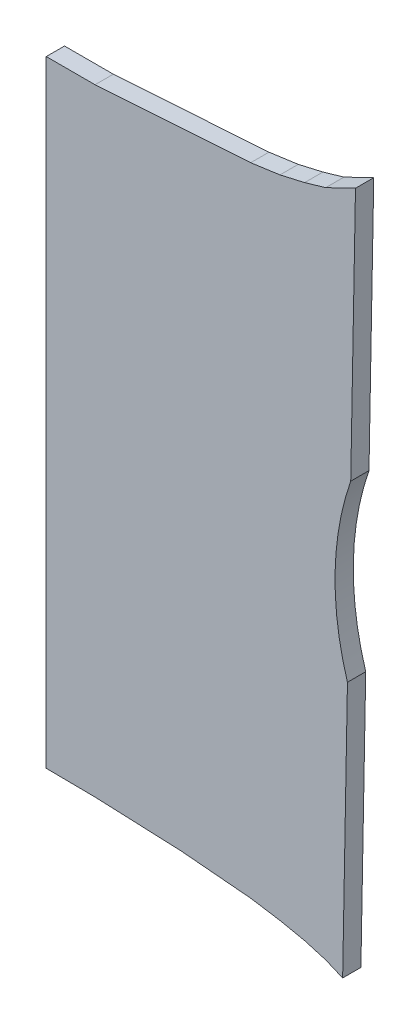
ISO-10303-21;
HEADER;
FILE_DESCRIPTION(('STEP AP214'),'2;1');
FILE_NAME('part.step','',(''),(''),'','','');
FILE_SCHEMA(('AUTOMOTIVE_DESIGN { 1 0 10303 214 1 1 1 1 }'));
ENDSEC;
DATA;
#1=APPLICATION_CONTEXT('core data for automotive mechanical design processes');
#2=APPLICATION_PROTOCOL_DEFINITION('international standard','automotive_design',2000,#1);
#3=PRODUCT_CONTEXT('',#1,'mechanical');
#4=PRODUCT('Part','Part','',(#3));
#5=PRODUCT_RELATED_PRODUCT_CATEGORY('part','',(#4));
#6=PRODUCT_DEFINITION_FORMATION('','',#4);
#7=PRODUCT_DEFINITION_CONTEXT('part definition',#1,'design');
#8=PRODUCT_DEFINITION('design','',#6,#7);
#9=PRODUCT_DEFINITION_SHAPE('','',#8);
#10=(LENGTH_UNIT() NAMED_UNIT(*) SI_UNIT(.MILLI.,.METRE.));
#11=(NAMED_UNIT(*) PLANE_ANGLE_UNIT() SI_UNIT($,.RADIAN.));
#12=(NAMED_UNIT(*) SI_UNIT($,.STERADIAN.) SOLID_ANGLE_UNIT());
#13=UNCERTAINTY_MEASURE_WITH_UNIT(LENGTH_MEASURE(1.E-05),#10,'distance_accuracy_value','');
#14=(GEOMETRIC_REPRESENTATION_CONTEXT(3) GLOBAL_UNCERTAINTY_ASSIGNED_CONTEXT((#13)) GLOBAL_UNIT_ASSIGNED_CONTEXT((#10,
#11,#12)) REPRESENTATION_CONTEXT('',''));
#15=CARTESIAN_POINT('',(0.,0.,0.));
#16=DIRECTION('',(0.,0.,1.));
#17=DIRECTION('',(1.,0.,0.));
#18=AXIS2_PLACEMENT_3D('',#15,#16,#17);
#19=CARTESIAN_POINT('',(95.5920028686523,57.8370018005371,0.));
#20=DIRECTION('',(1.,0.,0.));
#21=DIRECTION('',(0.,-1.,0.));
#22=AXIS2_PLACEMENT_3D('',#19,#20,#21);
#23=PLANE('',#22);
#24=DIRECTION('',(0.,-1.,0.));
#25=VECTOR('',#24,1.);
#26=CARTESIAN_POINT('',(95.5920028686523,57.8370018005371,0.03556));
#27=LINE('',#26,#25);
#28=CARTESIAN_POINT('',(95.5920028686523,57.8370018005371,0.03556));
#29=VERTEX_POINT('',#28);
#30=CARTESIAN_POINT('',(95.5920028686523,56.6370010375976,0.03556));
#31=VERTEX_POINT('',#30);
#32=EDGE_CURVE('E11',#29,#31,#27,.T.);
#33=ORIENTED_EDGE('',*,*,#32,.F.);
#34=DIRECTION('',(0.,0.,1.));
#35=VECTOR('',#34,1.);
#36=CARTESIAN_POINT('',(95.5920028686523,57.8370018005371,0.));
#37=LINE('',#36,#35);
#38=CARTESIAN_POINT('',(95.5920028686523,57.8370018005371,0.));
#39=VERTEX_POINT('',#38);
#40=EDGE_CURVE('E24',#39,#29,#37,.T.);
#41=ORIENTED_EDGE('',*,*,#40,.F.);
#42=DIRECTION('',(0.,-1.,0.));
#43=VECTOR('',#42,1.);
#44=CARTESIAN_POINT('',(95.5920028686523,57.8370018005371,0.));
#45=LINE('',#44,#43);
#46=CARTESIAN_POINT('',(95.5920028686523,56.6370010375976,0.));
#47=VERTEX_POINT('',#46);
#48=EDGE_CURVE('E269',#39,#47,#45,.T.);
#49=ORIENTED_EDGE('',*,*,#48,.T.);
#50=DIRECTION('',(0.,0.,1.));
#51=VECTOR('',#50,1.);
#52=CARTESIAN_POINT('',(95.5920028686523,56.6370010375976,0.));
#53=LINE('',#52,#51);
#54=EDGE_CURVE('E37',#47,#31,#53,.T.);
#55=ORIENTED_EDGE('',*,*,#54,.T.);
#56=EDGE_LOOP('',(#33,#41,#49,#55));
#57=FACE_BOUND('',#56,.T.);
#58=ADVANCED_FACE('F17',(#57),#23,.F.);
#59=CARTESIAN_POINT('',(95.6869964599609,57.8370018005371,0.));
#60=DIRECTION('',(0.,-1.,0.));
#61=DIRECTION('',(-1.,0.,0.));
#62=AXIS2_PLACEMENT_3D('',#59,#60,#61);
#63=PLANE('',#62);
#64=DIRECTION('',(-1.,0.,0.));
#65=VECTOR('',#64,1.);
#66=CARTESIAN_POINT('',(95.6869964599609,57.8370018005371,0.03556));
#67=LINE('',#66,#65);
#68=CARTESIAN_POINT('',(95.6869964599609,57.8370018005371,0.03556));
#69=VERTEX_POINT('',#68);
#70=EDGE_CURVE('E265',#69,#29,#67,.T.);
#71=ORIENTED_EDGE('',*,*,#70,.F.);
#72=DIRECTION('',(0.,0.,1.));
#73=VECTOR('',#72,1.);
#74=CARTESIAN_POINT('',(95.6869964599609,57.8370018005371,0.));
#75=LINE('',#74,#73);
#76=CARTESIAN_POINT('',(95.6869964599609,57.8370018005371,0.));
#77=VERTEX_POINT('',#76);
#78=EDGE_CURVE('E263',#77,#69,#75,.T.);
#79=ORIENTED_EDGE('',*,*,#78,.F.);
#80=DIRECTION('',(-1.,0.,0.));
#81=VECTOR('',#80,1.);
#82=CARTESIAN_POINT('',(95.6869964599609,57.8370018005371,0.));
#83=LINE('',#82,#81);
#84=EDGE_CURVE('E261',#77,#39,#83,.T.);
#85=ORIENTED_EDGE('',*,*,#84,.T.);
#86=ORIENTED_EDGE('',*,*,#40,.T.);
#87=EDGE_LOOP('',(#71,#79,#85,#86));
#88=FACE_BOUND('',#87,.T.);
#89=ADVANCED_FACE('F272',(#88),#63,.F.);
#90=CARTESIAN_POINT('',(95.9899978637695,57.8569984436035,0.));
#91=DIRECTION('',(0.0658519669274683,-0.997829403481268,0.));
#92=DIRECTION('',(-0.997829403481268,-0.0658519669274683,0.));
#93=AXIS2_PLACEMENT_3D('',#90,#91,#92);
#94=PLANE('',#93);
#95=DIRECTION('',(-0.997829403481268,-0.0658519669274683,0.));
#96=VECTOR('',#95,1.);
#97=CARTESIAN_POINT('',(95.9899978637695,57.8569984436035,0.03556));
#98=LINE('',#97,#96);
#99=CARTESIAN_POINT('',(95.9899978637695,57.8569984436035,0.03556));
#100=VERTEX_POINT('',#99);
#101=EDGE_CURVE('E258',#100,#69,#98,.T.);
#102=ORIENTED_EDGE('',*,*,#101,.F.);
#103=DIRECTION('',(0.,0.,1.));
#104=VECTOR('',#103,1.);
#105=CARTESIAN_POINT('',(95.9899978637695,57.8569984436035,0.));
#106=LINE('',#105,#104);
#107=CARTESIAN_POINT('',(95.9899978637695,57.8569984436035,0.));
#108=VERTEX_POINT('',#107);
#109=EDGE_CURVE('E256',#108,#100,#106,.T.);
#110=ORIENTED_EDGE('',*,*,#109,.F.);
#111=DIRECTION('',(-0.997829403481268,-0.0658519669274683,0.));
#112=VECTOR('',#111,1.);
#113=CARTESIAN_POINT('',(95.9899978637695,57.8569984436035,0.));
#114=LINE('',#113,#112);
#115=EDGE_CURVE('E253',#108,#77,#114,.T.);
#116=ORIENTED_EDGE('',*,*,#115,.T.);
#117=ORIENTED_EDGE('',*,*,#78,.T.);
#118=EDGE_LOOP('',(#102,#110,#116,#117));
#119=FACE_BOUND('',#118,.T.);
#120=ADVANCED_FACE('F275',(#119),#94,.F.);
#121=CARTESIAN_POINT('',(96.0469970703125,57.8650016784668,0.));
#122=DIRECTION('',(0.139045641329027,-0.990285973659831,0.));
#123=DIRECTION('',(-0.990285973659831,-0.139045641329027,0.));
#124=AXIS2_PLACEMENT_3D('',#121,#122,#123);
#125=PLANE('',#124);
#126=DIRECTION('',(-0.990285973659831,-0.139045641329027,0.));
#127=VECTOR('',#126,1.);
#128=CARTESIAN_POINT('',(96.0469970703125,57.8650016784668,0.03556));
#129=LINE('',#128,#127);
#130=CARTESIAN_POINT('',(96.0469970703125,57.8650016784668,0.03556));
#131=VERTEX_POINT('',#130);
#132=EDGE_CURVE('E250',#131,#100,#129,.T.);
#133=ORIENTED_EDGE('',*,*,#132,.F.);
#134=DIRECTION('',(0.,0.,1.));
#135=VECTOR('',#134,1.);
#136=CARTESIAN_POINT('',(96.0469970703125,57.8650016784668,0.));
#137=LINE('',#136,#135);
#138=CARTESIAN_POINT('',(96.0469970703125,57.8650016784668,0.));
#139=VERTEX_POINT('',#138);
#140=EDGE_CURVE('E248',#139,#131,#137,.T.);
#141=ORIENTED_EDGE('',*,*,#140,.F.);
#142=DIRECTION('',(-0.990285973659831,-0.139045641329027,0.));
#143=VECTOR('',#142,1.);
#144=CARTESIAN_POINT('',(96.0469970703125,57.8650016784668,0.));
#145=LINE('',#144,#143);
#146=EDGE_CURVE('E245',#139,#108,#145,.T.);
#147=ORIENTED_EDGE('',*,*,#146,.T.);
#148=ORIENTED_EDGE('',*,*,#109,.T.);
#149=EDGE_LOOP('',(#133,#141,#147,#148));
#150=FACE_BOUND('',#149,.T.);
#151=ADVANCED_FACE('F280',(#150),#125,.F.);
#152=CARTESIAN_POINT('',(96.0950012207031,57.8759994506836,0.));
#153=DIRECTION('',(0.223314827378712,-0.974746371048806,0.));
#154=DIRECTION('',(-0.974746371048806,-0.223314827378712,0.));
#155=AXIS2_PLACEMENT_3D('',#152,#153,#154);
#156=PLANE('',#155);
#157=DIRECTION('',(-0.974746371048806,-0.223314827378712,0.));
#158=VECTOR('',#157,1.);
#159=CARTESIAN_POINT('',(96.0950012207031,57.8759994506836,0.03556));
#160=LINE('',#159,#158);
#161=CARTESIAN_POINT('',(96.0950012207031,57.8759994506836,0.03556));
#162=VERTEX_POINT('',#161);
#163=EDGE_CURVE('E242',#162,#131,#160,.T.);
#164=ORIENTED_EDGE('',*,*,#163,.F.);
#165=DIRECTION('',(0.,0.,1.));
#166=VECTOR('',#165,1.);
#167=CARTESIAN_POINT('',(96.0950012207031,57.8759994506836,0.));
#168=LINE('',#167,#166);
#169=CARTESIAN_POINT('',(96.0950012207031,57.8759994506836,0.));
#170=VERTEX_POINT('',#169);
#171=EDGE_CURVE('E240',#170,#162,#168,.T.);
#172=ORIENTED_EDGE('',*,*,#171,.F.);
#173=DIRECTION('',(-0.974746371048806,-0.223314827378712,0.));
#174=VECTOR('',#173,1.);
#175=CARTESIAN_POINT('',(96.0950012207031,57.8759994506836,0.));
#176=LINE('',#175,#174);
#177=EDGE_CURVE('E237',#170,#139,#176,.T.);
#178=ORIENTED_EDGE('',*,*,#177,.T.);
#179=ORIENTED_EDGE('',*,*,#140,.T.);
#180=EDGE_LOOP('',(#164,#172,#178,#179));
#181=FACE_BOUND('',#180,.T.);
#182=ADVANCED_FACE('F283',(#181),#156,.F.);
#183=CARTESIAN_POINT('',(96.1360015869141,57.8880004882812,0.));
#184=DIRECTION('',(0.280918813771343,-0.959731535414619,0.));
#185=DIRECTION('',(-0.959731535414619,-0.280918813771343,0.));
#186=AXIS2_PLACEMENT_3D('',#183,#184,#185);
#187=PLANE('',#186);
#188=DIRECTION('',(-0.959731535414619,-0.280918813771343,0.));
#189=VECTOR('',#188,1.);
#190=CARTESIAN_POINT('',(96.1360015869141,57.8880004882812,0.03556));
#191=LINE('',#190,#189);
#192=CARTESIAN_POINT('',(96.1360015869141,57.8880004882812,0.03556));
#193=VERTEX_POINT('',#192);
#194=EDGE_CURVE('E234',#193,#162,#191,.T.);
#195=ORIENTED_EDGE('',*,*,#194,.F.);
#196=DIRECTION('',(0.,0.,1.));
#197=VECTOR('',#196,1.);
#198=CARTESIAN_POINT('',(96.1360015869141,57.8880004882812,0.));
#199=LINE('',#198,#197);
#200=CARTESIAN_POINT('',(96.1360015869141,57.8880004882812,0.));
#201=VERTEX_POINT('',#200);
#202=EDGE_CURVE('E232',#201,#193,#199,.T.);
#203=ORIENTED_EDGE('',*,*,#202,.F.);
#204=DIRECTION('',(-0.959731535414619,-0.280918813771343,0.));
#205=VECTOR('',#204,1.);
#206=CARTESIAN_POINT('',(96.1360015869141,57.8880004882812,0.));
#207=LINE('',#206,#205);
#208=EDGE_CURVE('E229',#201,#170,#207,.T.);
#209=ORIENTED_EDGE('',*,*,#208,.T.);
#210=ORIENTED_EDGE('',*,*,#171,.T.);
#211=EDGE_LOOP('',(#195,#203,#209,#210));
#212=FACE_BOUND('',#211,.T.);
#213=ADVANCED_FACE('F288',(#212),#187,.F.);
#214=CARTESIAN_POINT('',(96.1940002441406,57.9160003662109,0.));
#215=DIRECTION('',(0.434755691468777,-0.900548437750855,0.));
#216=DIRECTION('',(-0.900548437750855,-0.434755691468777,0.));
#217=AXIS2_PLACEMENT_3D('',#214,#215,#216);
#218=PLANE('',#217);
#219=DIRECTION('',(-0.900548437750855,-0.434755691468777,0.));
#220=VECTOR('',#219,1.);
#221=CARTESIAN_POINT('',(96.1940002441406,57.9160003662109,0.03556));
#222=LINE('',#221,#220);
#223=CARTESIAN_POINT('',(96.1940002441406,57.9160003662109,0.03556));
#224=VERTEX_POINT('',#223);
#225=EDGE_CURVE('E226',#224,#193,#222,.T.);
#226=ORIENTED_EDGE('',*,*,#225,.F.);
#227=DIRECTION('',(0.,0.,1.));
#228=VECTOR('',#227,1.);
#229=CARTESIAN_POINT('',(96.1940002441406,57.9160003662109,0.));
#230=LINE('',#229,#228);
#231=CARTESIAN_POINT('',(96.1940002441406,57.9160003662109,0.));
#232=VERTEX_POINT('',#231);
#233=EDGE_CURVE('E224',#232,#224,#230,.T.);
#234=ORIENTED_EDGE('',*,*,#233,.F.);
#235=DIRECTION('',(-0.900548437750855,-0.434755691468777,0.));
#236=VECTOR('',#235,1.);
#237=CARTESIAN_POINT('',(96.1940002441406,57.9160003662109,0.));
#238=LINE('',#237,#236);
#239=EDGE_CURVE('E221',#232,#201,#238,.T.);
#240=ORIENTED_EDGE('',*,*,#239,.T.);
#241=ORIENTED_EDGE('',*,*,#202,.T.);
#242=EDGE_LOOP('',(#226,#234,#240,#241));
#243=FACE_BOUND('',#242,.T.);
#244=ADVANCED_FACE('F291',(#243),#218,.F.);
#245=CARTESIAN_POINT('',(96.1847268356561,57.4174916960753,0.));
#246=DIRECTION('',(-0.999827022085491,0.0185990835166362,0.));
#247=DIRECTION('',(0.0185990835166362,0.999827022085491,0.));
#248=AXIS2_PLACEMENT_3D('',#245,#246,#247);
#249=PLANE('',#248);
#250=DIRECTION('',(0.0185990835166362,0.999827022085491,0.));
#251=VECTOR('',#250,1.);
#252=CARTESIAN_POINT('',(96.1689987182617,56.5719985961914,0.03556));
#253=LINE('',#252,#251);
#254=CARTESIAN_POINT('',(96.1847268356561,57.4174916960753,0.03556));
#255=VERTEX_POINT('',#254);
#256=EDGE_CURVE('E218',#255,#224,#253,.T.);
#257=ORIENTED_EDGE('',*,*,#256,.F.);
#258=DIRECTION('',(0.,0.,1.));
#259=VECTOR('',#258,1.);
#260=CARTESIAN_POINT('',(96.1847268356561,57.4174916960753,0.));
#261=LINE('',#260,#259);
#262=CARTESIAN_POINT('',(96.1847268356561,57.4174916960753,0.));
#263=VERTEX_POINT('',#262);
#264=EDGE_CURVE('E216',#263,#255,#261,.T.);
#265=ORIENTED_EDGE('',*,*,#264,.F.);
#266=DIRECTION('',(0.0185990835166362,0.999827022085491,0.));
#267=VECTOR('',#266,1.);
#268=CARTESIAN_POINT('',(96.1689987182617,56.5719985961914,0.));
#269=LINE('',#268,#267);
#270=EDGE_CURVE('E213',#263,#232,#269,.T.);
#271=ORIENTED_EDGE('',*,*,#270,.T.);
#272=ORIENTED_EDGE('',*,*,#233,.T.);
#273=EDGE_LOOP('',(#257,#265,#271,#272));
#274=FACE_BOUND('',#273,.T.);
#275=ADVANCED_FACE('F296',(#274),#249,.F.);
#276=CARTESIAN_POINT('',(96.70415,57.2366648,0.));
#277=DIRECTION('',(0.,0.,-1.));
#278=DIRECTION('',(1.,0.,0.));
#279=AXIS2_PLACEMENT_3D('',#276,#277,#278);
#280=CYLINDRICAL_SURFACE('',#279,0.5499989);
#281=ORIENTED_EDGE('',*,*,#264,.T.);
#282=CARTESIAN_POINT('',(96.70415,57.2366648,0.03556));
#283=DIRECTION('',(0.,0.,1.));
#284=DIRECTION('',(1.,0.,0.));
#285=AXIS2_PLACEMENT_3D('',#282,#283,#284);
#286=CIRCLE('',#285,0.5499989);
#287=CARTESIAN_POINT('',(96.1783609339547,57.0752812567609,0.03556));
#288=VERTEX_POINT('',#287);
#289=EDGE_CURVE('E210',#255,#288,#286,.T.);
#290=ORIENTED_EDGE('',*,*,#289,.T.);
#291=DIRECTION('',(0.,0.,1.));
#292=VECTOR('',#291,1.);
#293=CARTESIAN_POINT('',(96.1783609339547,57.0752812567609,0.));
#294=LINE('',#293,#292);
#295=CARTESIAN_POINT('',(96.1783609339547,57.0752812567609,0.));
#296=VERTEX_POINT('',#295);
#297=EDGE_CURVE('E208',#296,#288,#294,.T.);
#298=ORIENTED_EDGE('',*,*,#297,.F.);
#299=CARTESIAN_POINT('',(96.70415,57.2366648,0.));
#300=DIRECTION('',(0.,0.,1.));
#301=DIRECTION('',(1.,0.,0.));
#302=AXIS2_PLACEMENT_3D('',#299,#300,#301);
#303=CIRCLE('',#302,0.5499989);
#304=EDGE_CURVE('E205',#263,#296,#303,.T.);
#305=ORIENTED_EDGE('',*,*,#304,.F.);
#306=EDGE_LOOP('',(#281,#290,#298,#305));
#307=FACE_BOUND('',#306,.T.);
#308=ADVANCED_FACE('F299',(#307),#280,.F.);
#309=CARTESIAN_POINT('',(96.1689987182617,56.5719985961914,0.));
#310=DIRECTION('',(-0.999827022085491,0.0185990835166362,0.));
#311=DIRECTION('',(0.0185990835166362,0.999827022085491,0.));
#312=AXIS2_PLACEMENT_3D('',#309,#310,#311);
#313=PLANE('',#312);
#314=DIRECTION('',(0.0185990835166362,0.999827022085491,0.));
#315=VECTOR('',#314,1.);
#316=CARTESIAN_POINT('',(96.1689987182617,56.5719985961914,0.03556));
#317=LINE('',#316,#315);
#318=CARTESIAN_POINT('',(96.1689987182617,56.5719985961914,0.03556));
#319=VERTEX_POINT('',#318);
#320=EDGE_CURVE('E202',#319,#288,#317,.T.);
#321=ORIENTED_EDGE('',*,*,#320,.F.);
#322=DIRECTION('',(0.,0.,1.));
#323=VECTOR('',#322,1.);
#324=CARTESIAN_POINT('',(96.1689987182617,56.5719985961914,0.));
#325=LINE('',#324,#323);
#326=CARTESIAN_POINT('',(96.1689987182617,56.5719985961914,0.));
#327=VERTEX_POINT('',#326);
#328=EDGE_CURVE('E200',#327,#319,#325,.T.);
#329=ORIENTED_EDGE('',*,*,#328,.F.);
#330=EDGE_CURVE('E199',#327,#296,#269,.T.);
#331=ORIENTED_EDGE('',*,*,#330,.T.);
#332=ORIENTED_EDGE('',*,*,#297,.T.);
#333=EDGE_LOOP('',(#321,#329,#331,#332));
#334=FACE_BOUND('',#333,.T.);
#335=ADVANCED_FACE('F305',(#334),#313,.F.);
#336=CARTESIAN_POINT('',(96.1360015869141,56.5859985351562,0.));
#337=DIRECTION('',(0.390577177437888,0.920570186604287,0.));
#338=DIRECTION('',(0.920570186604287,-0.390577177437888,0.));
#339=AXIS2_PLACEMENT_3D('',#336,#337,#338);
#340=PLANE('',#339);
#341=DIRECTION('',(0.920570186604287,-0.390577177437888,0.));
#342=VECTOR('',#341,1.);
#343=CARTESIAN_POINT('',(96.1360015869141,56.5859985351562,0.03556));
#344=LINE('',#343,#342);
#345=CARTESIAN_POINT('',(96.1360015869141,56.5859985351562,0.03556));
#346=VERTEX_POINT('',#345);
#347=EDGE_CURVE('E196',#346,#319,#344,.T.);
#348=ORIENTED_EDGE('',*,*,#347,.F.);
#349=DIRECTION('',(0.,0.,1.));
#350=VECTOR('',#349,1.);
#351=CARTESIAN_POINT('',(96.1360015869141,56.5859985351562,0.));
#352=LINE('',#351,#350);
#353=CARTESIAN_POINT('',(96.1360015869141,56.5859985351562,0.));
#354=VERTEX_POINT('',#353);
#355=EDGE_CURVE('E194',#354,#346,#352,.T.);
#356=ORIENTED_EDGE('',*,*,#355,.F.);
#357=DIRECTION('',(0.920570186604287,-0.390577177437888,0.));
#358=VECTOR('',#357,1.);
#359=CARTESIAN_POINT('',(96.1360015869141,56.5859985351562,0.));
#360=LINE('',#359,#358);
#361=EDGE_CURVE('E191',#354,#327,#360,.T.);
#362=ORIENTED_EDGE('',*,*,#361,.T.);
#363=ORIENTED_EDGE('',*,*,#328,.T.);
#364=EDGE_LOOP('',(#348,#356,#362,#363));
#365=FACE_BOUND('',#364,.T.);
#366=ADVANCED_FACE('F308',(#365),#340,.F.);
#367=CARTESIAN_POINT('',(96.0950012207031,56.5979995727539,0.));
#368=DIRECTION('',(0.280918813771343,0.959731535414619,0.));
#369=DIRECTION('',(0.959731535414619,-0.280918813771343,0.));
#370=AXIS2_PLACEMENT_3D('',#367,#368,#369);
#371=PLANE('',#370);
#372=DIRECTION('',(0.959731535414619,-0.280918813771343,0.));
#373=VECTOR('',#372,1.);
#374=CARTESIAN_POINT('',(96.0950012207031,56.5979995727539,0.03556));
#375=LINE('',#374,#373);
#376=CARTESIAN_POINT('',(96.0950012207031,56.5979995727539,0.03556));
#377=VERTEX_POINT('',#376);
#378=EDGE_CURVE('E188',#377,#346,#375,.T.);
#379=ORIENTED_EDGE('',*,*,#378,.F.);
#380=DIRECTION('',(0.,0.,1.));
#381=VECTOR('',#380,1.);
#382=CARTESIAN_POINT('',(96.0950012207031,56.5979995727539,0.));
#383=LINE('',#382,#381);
#384=CARTESIAN_POINT('',(96.0950012207031,56.5979995727539,0.));
#385=VERTEX_POINT('',#384);
#386=EDGE_CURVE('E186',#385,#377,#383,.T.);
#387=ORIENTED_EDGE('',*,*,#386,.F.);
#388=DIRECTION('',(0.959731535414619,-0.280918813771343,0.));
#389=VECTOR('',#388,1.);
#390=CARTESIAN_POINT('',(96.0950012207031,56.5979995727539,0.));
#391=LINE('',#390,#389);
#392=EDGE_CURVE('E183',#385,#354,#391,.T.);
#393=ORIENTED_EDGE('',*,*,#392,.T.);
#394=ORIENTED_EDGE('',*,*,#355,.T.);
#395=EDGE_LOOP('',(#379,#387,#393,#394));
#396=FACE_BOUND('',#395,.T.);
#397=ADVANCED_FACE('F313',(#396),#371,.F.);
#398=CARTESIAN_POINT('',(96.0469970703125,56.6080017089844,0.));
#399=DIRECTION('',(0.203979107099836,0.978975241702646,0.));
#400=DIRECTION('',(0.978975241702646,-0.203979107099836,0.));
#401=AXIS2_PLACEMENT_3D('',#398,#399,#400);
#402=PLANE('',#401);
#403=DIRECTION('',(0.978975241702646,-0.203979107099836,0.));
#404=VECTOR('',#403,1.);
#405=CARTESIAN_POINT('',(96.0469970703125,56.6080017089844,0.03556));
#406=LINE('',#405,#404);
#407=CARTESIAN_POINT('',(96.0469970703125,56.6080017089844,0.03556));
#408=VERTEX_POINT('',#407);
#409=EDGE_CURVE('E180',#408,#377,#406,.T.);
#410=ORIENTED_EDGE('',*,*,#409,.F.);
#411=DIRECTION('',(0.,0.,1.));
#412=VECTOR('',#411,1.);
#413=CARTESIAN_POINT('',(96.0469970703125,56.6080017089844,0.));
#414=LINE('',#413,#412);
#415=CARTESIAN_POINT('',(96.0469970703125,56.6080017089844,0.));
#416=VERTEX_POINT('',#415);
#417=EDGE_CURVE('E178',#416,#408,#414,.T.);
#418=ORIENTED_EDGE('',*,*,#417,.F.);
#419=DIRECTION('',(0.978975241702646,-0.203979107099836,0.));
#420=VECTOR('',#419,1.);
#421=CARTESIAN_POINT('',(96.0469970703125,56.6080017089844,0.));
#422=LINE('',#421,#420);
#423=EDGE_CURVE('E175',#416,#385,#422,.T.);
#424=ORIENTED_EDGE('',*,*,#423,.T.);
#425=ORIENTED_EDGE('',*,*,#386,.T.);
#426=EDGE_LOOP('',(#410,#418,#424,#425));
#427=FACE_BOUND('',#426,.T.);
#428=ADVANCED_FACE('F316',(#427),#402,.F.);
#429=CARTESIAN_POINT('',(95.9899978637695,56.617000579834,0.));
#430=DIRECTION('',(0.155945600119541,0.987765645182781,0.));
#431=DIRECTION('',(0.987765645182781,-0.155945600119541,0.));
#432=AXIS2_PLACEMENT_3D('',#429,#430,#431);
#433=PLANE('',#432);
#434=DIRECTION('',(0.987765645182781,-0.155945600119541,0.));
#435=VECTOR('',#434,1.);
#436=CARTESIAN_POINT('',(95.9899978637695,56.617000579834,0.03556));
#437=LINE('',#436,#435);
#438=CARTESIAN_POINT('',(95.9899978637695,56.617000579834,0.03556));
#439=VERTEX_POINT('',#438);
#440=EDGE_CURVE('E172',#439,#408,#437,.T.);
#441=ORIENTED_EDGE('',*,*,#440,.F.);
#442=DIRECTION('',(0.,0.,1.));
#443=VECTOR('',#442,1.);
#444=CARTESIAN_POINT('',(95.9899978637695,56.617000579834,0.));
#445=LINE('',#444,#443);
#446=CARTESIAN_POINT('',(95.9899978637695,56.617000579834,0.));
#447=VERTEX_POINT('',#446);
#448=EDGE_CURVE('E170',#447,#439,#445,.T.);
#449=ORIENTED_EDGE('',*,*,#448,.F.);
#450=DIRECTION('',(0.987765645182781,-0.155945600119541,0.));
#451=VECTOR('',#450,1.);
#452=CARTESIAN_POINT('',(95.9899978637695,56.617000579834,0.));
#453=LINE('',#452,#451);
#454=EDGE_CURVE('E167',#447,#416,#453,.T.);
#455=ORIENTED_EDGE('',*,*,#454,.T.);
#456=ORIENTED_EDGE('',*,*,#417,.T.);
#457=EDGE_LOOP('',(#441,#449,#455,#456));
#458=FACE_BOUND('',#457,.T.);
#459=ADVANCED_FACE('F319',(#458),#433,.F.);
#460=CARTESIAN_POINT('',(95.8539962768555,56.6290016174316,0.));
#461=DIRECTION('',(0.0879003337061126,0.996129274408876,0.));
#462=DIRECTION('',(0.996129274408876,-0.0879003337061126,0.));
#463=AXIS2_PLACEMENT_3D('',#460,#461,#462);
#464=PLANE('',#463);
#465=DIRECTION('',(0.996129274408876,-0.0879003337061126,0.));
#466=VECTOR('',#465,1.);
#467=CARTESIAN_POINT('',(95.8539962768555,56.6290016174316,0.03556));
#468=LINE('',#467,#466);
#469=CARTESIAN_POINT('',(95.8539962768555,56.6290016174316,0.03556));
#470=VERTEX_POINT('',#469);
#471=EDGE_CURVE('E164',#470,#439,#468,.T.);
#472=ORIENTED_EDGE('',*,*,#471,.F.);
#473=DIRECTION('',(0.,0.,1.));
#474=VECTOR('',#473,1.);
#475=CARTESIAN_POINT('',(95.8539962768555,56.6290016174316,0.));
#476=LINE('',#475,#474);
#477=CARTESIAN_POINT('',(95.8539962768555,56.6290016174316,0.));
#478=VERTEX_POINT('',#477);
#479=EDGE_CURVE('E162',#478,#470,#476,.T.);
#480=ORIENTED_EDGE('',*,*,#479,.F.);
#481=DIRECTION('',(0.996129274408876,-0.0879003337061126,0.));
#482=VECTOR('',#481,1.);
#483=CARTESIAN_POINT('',(95.8539962768555,56.6290016174316,0.));
#484=LINE('',#483,#482);
#485=EDGE_CURVE('E153',#478,#447,#484,.T.);
#486=ORIENTED_EDGE('',*,*,#485,.T.);
#487=ORIENTED_EDGE('',*,*,#448,.T.);
#488=EDGE_LOOP('',(#472,#480,#486,#487));
#489=FACE_BOUND('',#488,.T.);
#490=ADVANCED_FACE('F322',(#489),#464,.F.);
#491=CARTESIAN_POINT('',(95.6869964599609,56.6360015869141,0.));
#492=DIRECTION('',(0.0418792570717929,0.999122679067548,0.));
#493=DIRECTION('',(0.999122679067548,-0.0418792570717929,0.));
#494=AXIS2_PLACEMENT_3D('',#491,#492,#493);
#495=PLANE('',#494);
#496=DIRECTION('',(0.999122679067548,-0.0418792570717929,0.));
#497=VECTOR('',#496,1.);
#498=CARTESIAN_POINT('',(95.6869964599609,56.6360015869141,0.03556));
#499=LINE('',#498,#497);
#500=CARTESIAN_POINT('',(95.6869964599609,56.6360015869141,0.03556));
#501=VERTEX_POINT('',#500);
#502=EDGE_CURVE('E139',#501,#470,#499,.T.);
#503=ORIENTED_EDGE('',*,*,#502,.F.);
#504=DIRECTION('',(0.,0.,1.));
#505=VECTOR('',#504,1.);
#506=CARTESIAN_POINT('',(95.6869964599609,56.6360015869141,0.));
#507=LINE('',#506,#505);
#508=CARTESIAN_POINT('',(95.6869964599609,56.6360015869141,0.));
#509=VERTEX_POINT('',#508);
#510=EDGE_CURVE('E134',#509,#501,#507,.T.);
#511=ORIENTED_EDGE('',*,*,#510,.F.);
#512=DIRECTION('',(0.999122679067548,-0.0418792570717929,0.));
#513=VECTOR('',#512,1.);
#514=CARTESIAN_POINT('',(95.6869964599609,56.6360015869141,0.));
#515=LINE('',#514,#513);
#516=EDGE_CURVE('E137',#509,#478,#515,.T.);
#517=ORIENTED_EDGE('',*,*,#516,.T.);
#518=ORIENTED_EDGE('',*,*,#479,.T.);
#519=EDGE_LOOP('',(#503,#511,#517,#518));
#520=FACE_BOUND('',#519,.T.);
#521=ADVANCED_FACE('F136',(#520),#495,.F.);
#522=CARTESIAN_POINT('',(95.5920028686523,56.6370010375977,0.));
#523=DIRECTION('',(0.0105206609892561,0.999944656314713,0.));
#524=DIRECTION('',(0.999944656314713,-0.0105206609892561,0.));
#525=AXIS2_PLACEMENT_3D('',#522,#523,#524);
#526=PLANE('',#525);
#527=DIRECTION('',(0.999944656314713,-0.0105206609892561,0.));
#528=VECTOR('',#527,1.);
#529=CARTESIAN_POINT('',(95.5920028686523,56.6370010375976,0.03556));
#530=LINE('',#529,#528);
#531=EDGE_CURVE('E154',#31,#501,#530,.T.);
#532=ORIENTED_EDGE('',*,*,#531,.F.);
#533=ORIENTED_EDGE('',*,*,#54,.F.);
#534=DIRECTION('',(0.999944656314713,-0.0105206609892561,0.));
#535=VECTOR('',#534,1.);
#536=CARTESIAN_POINT('',(95.5920028686523,56.6370010375976,0.));
#537=LINE('',#536,#535);
#538=EDGE_CURVE('E150',#47,#509,#537,.T.);
#539=ORIENTED_EDGE('',*,*,#538,.T.);
#540=ORIENTED_EDGE('',*,*,#510,.T.);
#541=EDGE_LOOP('',(#532,#533,#539,#540));
#542=FACE_BOUND('',#541,.T.);
#543=ADVANCED_FACE('F156',(#542),#526,.F.);
#544=CARTESIAN_POINT('',(95.5920028686523,56.6370010375977,0.));
#545=DIRECTION('',(0.,0.,1.));
#546=DIRECTION('',(1.,0.,0.));
#547=AXIS2_PLACEMENT_3D('',#544,#545,#546);
#548=PLANE('',#547);
#549=ORIENTED_EDGE('',*,*,#538,.F.);
#550=ORIENTED_EDGE('',*,*,#48,.F.);
#551=ORIENTED_EDGE('',*,*,#84,.F.);
#552=ORIENTED_EDGE('',*,*,#115,.F.);
#553=ORIENTED_EDGE('',*,*,#146,.F.);
#554=ORIENTED_EDGE('',*,*,#177,.F.);
#555=ORIENTED_EDGE('',*,*,#208,.F.);
#556=ORIENTED_EDGE('',*,*,#239,.F.);
#557=ORIENTED_EDGE('',*,*,#270,.F.);
#558=ORIENTED_EDGE('',*,*,#304,.T.);
#559=ORIENTED_EDGE('',*,*,#330,.F.);
#560=ORIENTED_EDGE('',*,*,#361,.F.);
#561=ORIENTED_EDGE('',*,*,#392,.F.);
#562=ORIENTED_EDGE('',*,*,#423,.F.);
#563=ORIENTED_EDGE('',*,*,#454,.F.);
#564=ORIENTED_EDGE('',*,*,#485,.F.);
#565=ORIENTED_EDGE('',*,*,#516,.F.);
#566=EDGE_LOOP('',(#549,#550,#551,#552,#553,#554,#555,#556,#557,#558,#559,#560,#561,#562,#563,
#564,#565));
#567=FACE_BOUND('',#566,.T.);
#568=ADVANCED_FACE('F148',(#567),#548,.F.);
#569=CARTESIAN_POINT('',(95.5920028686523,56.6370010375977,0.03556));
#570=DIRECTION('',(0.,0.,1.));
#571=DIRECTION('',(1.,0.,0.));
#572=AXIS2_PLACEMENT_3D('',#569,#570,#571);
#573=PLANE('',#572);
#574=ORIENTED_EDGE('',*,*,#32,.T.);
#575=ORIENTED_EDGE('',*,*,#531,.T.);
#576=ORIENTED_EDGE('',*,*,#502,.T.);
#577=ORIENTED_EDGE('',*,*,#471,.T.);
#578=ORIENTED_EDGE('',*,*,#440,.T.);
#579=ORIENTED_EDGE('',*,*,#409,.T.);
#580=ORIENTED_EDGE('',*,*,#378,.T.);
#581=ORIENTED_EDGE('',*,*,#347,.T.);
#582=ORIENTED_EDGE('',*,*,#320,.T.);
#583=ORIENTED_EDGE('',*,*,#289,.F.);
#584=ORIENTED_EDGE('',*,*,#256,.T.);
#585=ORIENTED_EDGE('',*,*,#225,.T.);
#586=ORIENTED_EDGE('',*,*,#194,.T.);
#587=ORIENTED_EDGE('',*,*,#163,.T.);
#588=ORIENTED_EDGE('',*,*,#132,.T.);
#589=ORIENTED_EDGE('',*,*,#101,.T.);
#590=ORIENTED_EDGE('',*,*,#70,.T.);
#591=EDGE_LOOP('',(#574,#575,#576,#577,#578,#579,#580,#581,#582,#583,#584,#585,#586,#587,#588,
#589,#590));
#592=FACE_BOUND('',#591,.T.);
#593=ADVANCED_FACE('F324',(#592),#573,.T.);
#594=CLOSED_SHELL('',(#58,#89,#120,#151,#182,#213,#244,#275,#308,#335,#366,#397,#428,#459,#490,
#521,#543,#568,#593));
#595=MANIFOLD_SOLID_BREP('B1',#594);
#596=ADVANCED_BREP_SHAPE_REPRESENTATION('',(#18,#595),#14);
#597=SHAPE_DEFINITION_REPRESENTATION(#9,#596);
ENDSEC;
END-ISO-10303-21;
